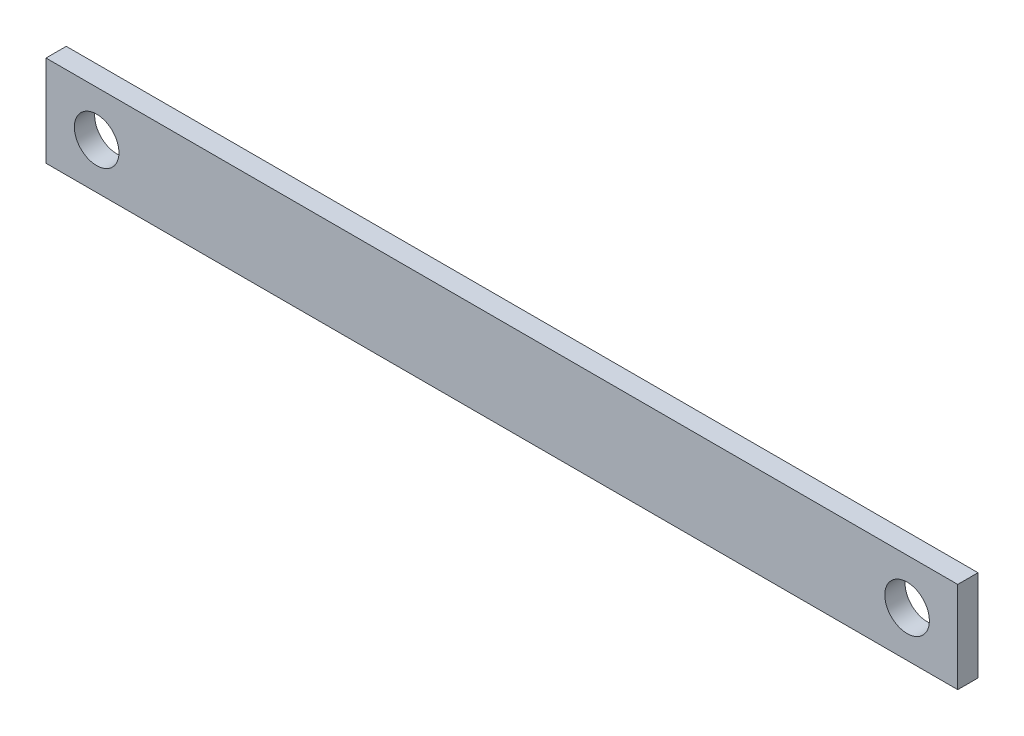
ISO-10303-21;
HEADER;
FILE_DESCRIPTION(('STEP AP214'),'2;1');
FILE_NAME('part.step','',(''),(''),'','','');
FILE_SCHEMA(('AUTOMOTIVE_DESIGN { 1 0 10303 214 1 1 1 1 }'));
ENDSEC;
DATA;
#1=APPLICATION_CONTEXT('core data for automotive mechanical design processes');
#2=APPLICATION_PROTOCOL_DEFINITION('international standard','automotive_design',2000,#1);
#3=PRODUCT_CONTEXT('',#1,'mechanical');
#4=PRODUCT('Part','Part','',(#3));
#5=PRODUCT_RELATED_PRODUCT_CATEGORY('part','',(#4));
#6=PRODUCT_DEFINITION_FORMATION('','',#4);
#7=PRODUCT_DEFINITION_CONTEXT('part definition',#1,'design');
#8=PRODUCT_DEFINITION('design','',#6,#7);
#9=PRODUCT_DEFINITION_SHAPE('','',#8);
#10=(LENGTH_UNIT() NAMED_UNIT(*) SI_UNIT(.MILLI.,.METRE.));
#11=(NAMED_UNIT(*) PLANE_ANGLE_UNIT() SI_UNIT($,.RADIAN.));
#12=(NAMED_UNIT(*) SI_UNIT($,.STERADIAN.) SOLID_ANGLE_UNIT());
#13=UNCERTAINTY_MEASURE_WITH_UNIT(LENGTH_MEASURE(1.E-05),#10,'distance_accuracy_value','');
#14=(GEOMETRIC_REPRESENTATION_CONTEXT(3) GLOBAL_UNCERTAINTY_ASSIGNED_CONTEXT((#13)) GLOBAL_UNIT_ASSIGNED_CONTEXT((#10,
#11,#12)) REPRESENTATION_CONTEXT('',''));
#15=CARTESIAN_POINT('',(0.,0.,0.));
#16=DIRECTION('',(0.,0.,1.));
#17=DIRECTION('',(1.,0.,0.));
#18=AXIS2_PLACEMENT_3D('',#15,#16,#17);
#19=CARTESIAN_POINT('',(0.,5.71499999999998,2.54));
#20=DIRECTION('',(0.,1.,0.));
#21=DIRECTION('',(0.,0.,1.));
#22=AXIS2_PLACEMENT_3D('',#19,#20,#21);
#23=PLANE('',#22);
#24=DIRECTION('',(1.,0.,0.));
#25=VECTOR('',#24,1.);
#26=CARTESIAN_POINT('',(0.,5.71499999999998,0.));
#27=LINE('',#26,#25);
#28=CARTESIAN_POINT('',(-57.15,5.71499999999998,0.));
#29=VERTEX_POINT('',#28);
#30=CARTESIAN_POINT('',(57.15,5.71499999999998,0.));
#31=VERTEX_POINT('',#30);
#32=EDGE_CURVE('E118',#29,#31,#27,.T.);
#33=ORIENTED_EDGE('',*,*,#32,.F.);
#34=DIRECTION('',(0.,0.,-1.));
#35=VECTOR('',#34,1.);
#36=CARTESIAN_POINT('',(-57.15,5.71499999999998,2.54));
#37=LINE('',#36,#35);
#38=CARTESIAN_POINT('',(-57.15,5.71499999999998,2.54));
#39=VERTEX_POINT('',#38);
#40=EDGE_CURVE('E11',#39,#29,#37,.T.);
#41=ORIENTED_EDGE('',*,*,#40,.F.);
#42=DIRECTION('',(1.,0.,0.));
#43=VECTOR('',#42,1.);
#44=CARTESIAN_POINT('',(0.,5.71499999999998,2.54));
#45=LINE('',#44,#43);
#46=CARTESIAN_POINT('',(57.15,5.71499999999998,2.54));
#47=VERTEX_POINT('',#46);
#48=EDGE_CURVE('E99',#39,#47,#45,.T.);
#49=ORIENTED_EDGE('',*,*,#48,.T.);
#50=DIRECTION('',(0.,0.,-1.));
#51=VECTOR('',#50,1.);
#52=CARTESIAN_POINT('',(57.15,5.71499999999998,2.54));
#53=LINE('',#52,#51);
#54=EDGE_CURVE('E58',#47,#31,#53,.T.);
#55=ORIENTED_EDGE('',*,*,#54,.T.);
#56=EDGE_LOOP('',(#33,#41,#49,#55));
#57=FACE_BOUND('',#56,.T.);
#58=ADVANCED_FACE('F41',(#57),#23,.T.);
#59=CARTESIAN_POINT('',(-57.15,0.,2.54));
#60=DIRECTION('',(-1.,0.,0.));
#61=DIRECTION('',(0.,0.,1.));
#62=AXIS2_PLACEMENT_3D('',#59,#60,#61);
#63=PLANE('',#62);
#64=DIRECTION('',(0.,1.,0.));
#65=VECTOR('',#64,1.);
#66=CARTESIAN_POINT('',(-57.15,0.,0.));
#67=LINE('',#66,#65);
#68=CARTESIAN_POINT('',(-57.15,-5.71499999999998,0.));
#69=VERTEX_POINT('',#68);
#70=EDGE_CURVE('E88',#69,#29,#67,.T.);
#71=ORIENTED_EDGE('',*,*,#70,.F.);
#72=DIRECTION('',(0.,0.,-1.));
#73=VECTOR('',#72,1.);
#74=CARTESIAN_POINT('',(-57.15,-5.71499999999998,2.54));
#75=LINE('',#74,#73);
#76=CARTESIAN_POINT('',(-57.15,-5.71499999999998,2.54));
#77=VERTEX_POINT('',#76);
#78=EDGE_CURVE('E50',#77,#69,#75,.T.);
#79=ORIENTED_EDGE('',*,*,#78,.F.);
#80=DIRECTION('',(0.,1.,0.));
#81=VECTOR('',#80,1.);
#82=CARTESIAN_POINT('',(-57.15,0.,2.54));
#83=LINE('',#82,#81);
#84=EDGE_CURVE('E86',#77,#39,#83,.T.);
#85=ORIENTED_EDGE('',*,*,#84,.T.);
#86=ORIENTED_EDGE('',*,*,#40,.T.);
#87=EDGE_LOOP('',(#71,#79,#85,#86));
#88=FACE_BOUND('',#87,.T.);
#89=ADVANCED_FACE('F85',(#88),#63,.T.);
#90=CARTESIAN_POINT('',(0.,-5.71499999999998,2.54));
#91=DIRECTION('',(0.,-1.,0.));
#92=DIRECTION('',(0.,0.,-1.));
#93=AXIS2_PLACEMENT_3D('',#90,#91,#92);
#94=PLANE('',#93);
#95=DIRECTION('',(-1.,0.,0.));
#96=VECTOR('',#95,1.);
#97=CARTESIAN_POINT('',(0.,-5.71499999999998,0.));
#98=LINE('',#97,#96);
#99=CARTESIAN_POINT('',(57.15,-5.71499999999998,0.));
#100=VERTEX_POINT('',#99);
#101=EDGE_CURVE('E123',#100,#69,#98,.T.);
#102=ORIENTED_EDGE('',*,*,#101,.F.);
#103=DIRECTION('',(0.,0.,-1.));
#104=VECTOR('',#103,1.);
#105=CARTESIAN_POINT('',(57.15,-5.71499999999998,2.54));
#106=LINE('',#105,#104);
#107=CARTESIAN_POINT('',(57.15,-5.71499999999998,2.54));
#108=VERTEX_POINT('',#107);
#109=EDGE_CURVE('E71',#108,#100,#106,.T.);
#110=ORIENTED_EDGE('',*,*,#109,.F.);
#111=DIRECTION('',(-1.,0.,0.));
#112=VECTOR('',#111,1.);
#113=CARTESIAN_POINT('',(0.,-5.71499999999998,2.54));
#114=LINE('',#113,#112);
#115=EDGE_CURVE('E98',#108,#77,#114,.T.);
#116=ORIENTED_EDGE('',*,*,#115,.T.);
#117=ORIENTED_EDGE('',*,*,#78,.T.);
#118=EDGE_LOOP('',(#102,#110,#116,#117));
#119=FACE_BOUND('',#118,.T.);
#120=ADVANCED_FACE('F102',(#119),#94,.T.);
#121=CARTESIAN_POINT('',(-50.8,0.,2.54));
#122=DIRECTION('',(0.,0.,-1.));
#123=DIRECTION('',(-1.,0.,0.));
#124=AXIS2_PLACEMENT_3D('',#121,#122,#123);
#125=CYLINDRICAL_SURFACE('',#124,2.794);
#126=CARTESIAN_POINT('',(-50.8,0.,2.54));
#127=DIRECTION('',(0.,0.,1.));
#128=DIRECTION('',(1.,0.,0.));
#129=AXIS2_PLACEMENT_3D('',#126,#127,#128);
#130=CIRCLE('',#129,2.794);
#131=CARTESIAN_POINT('',(-48.006,0.,2.54));
#132=VERTEX_POINT('',#131);
#133=EDGE_CURVE('E107',#132,#132,#130,.T.);
#134=ORIENTED_EDGE('',*,*,#133,.T.);
#135=EDGE_LOOP('',(#134));
#136=FACE_BOUND('',#135,.T.);
#137=CARTESIAN_POINT('',(-50.8,0.,0.));
#138=DIRECTION('',(0.,0.,1.));
#139=DIRECTION('',(1.,0.,0.));
#140=AXIS2_PLACEMENT_3D('',#137,#138,#139);
#141=CIRCLE('',#140,2.794);
#142=CARTESIAN_POINT('',(-48.006,0.,0.));
#143=VERTEX_POINT('',#142);
#144=EDGE_CURVE('E130',#143,#143,#141,.T.);
#145=ORIENTED_EDGE('',*,*,#144,.F.);
#146=EDGE_LOOP('',(#145));
#147=FACE_BOUND('',#146,.T.);
#148=ADVANCED_FACE('F147',(#136,#147),#125,.F.);
#149=CARTESIAN_POINT('',(57.15,0.,2.54));
#150=DIRECTION('',(1.,0.,0.));
#151=DIRECTION('',(0.,0.,-1.));
#152=AXIS2_PLACEMENT_3D('',#149,#150,#151);
#153=PLANE('',#152);
#154=DIRECTION('',(0.,-1.,0.));
#155=VECTOR('',#154,1.);
#156=CARTESIAN_POINT('',(57.15,0.,0.));
#157=LINE('',#156,#155);
#158=EDGE_CURVE('E126',#31,#100,#157,.T.);
#159=ORIENTED_EDGE('',*,*,#158,.F.);
#160=ORIENTED_EDGE('',*,*,#54,.F.);
#161=DIRECTION('',(0.,-1.,0.));
#162=VECTOR('',#161,1.);
#163=CARTESIAN_POINT('',(57.15,0.,2.54));
#164=LINE('',#163,#162);
#165=EDGE_CURVE('E104',#47,#108,#164,.T.);
#166=ORIENTED_EDGE('',*,*,#165,.T.);
#167=ORIENTED_EDGE('',*,*,#109,.T.);
#168=EDGE_LOOP('',(#159,#160,#166,#167));
#169=FACE_BOUND('',#168,.T.);
#170=ADVANCED_FACE('F144',(#169),#153,.T.);
#171=CARTESIAN_POINT('',(50.8,0.,2.54));
#172=DIRECTION('',(0.,0.,-1.));
#173=DIRECTION('',(-1.,0.,0.));
#174=AXIS2_PLACEMENT_3D('',#171,#172,#173);
#175=CYLINDRICAL_SURFACE('',#174,2.794);
#176=CARTESIAN_POINT('',(50.8,0.,2.54));
#177=DIRECTION('',(0.,0.,1.));
#178=DIRECTION('',(1.,0.,0.));
#179=AXIS2_PLACEMENT_3D('',#176,#177,#178);
#180=CIRCLE('',#179,2.794);
#181=CARTESIAN_POINT('',(53.594,0.,2.54));
#182=VERTEX_POINT('',#181);
#183=EDGE_CURVE('E114',#182,#182,#180,.T.);
#184=ORIENTED_EDGE('',*,*,#183,.T.);
#185=EDGE_LOOP('',(#184));
#186=FACE_BOUND('',#185,.T.);
#187=CARTESIAN_POINT('',(50.8,0.,0.));
#188=DIRECTION('',(0.,0.,1.));
#189=DIRECTION('',(1.,0.,0.));
#190=AXIS2_PLACEMENT_3D('',#187,#188,#189);
#191=CIRCLE('',#190,2.794);
#192=CARTESIAN_POINT('',(53.594,0.,0.));
#193=VERTEX_POINT('',#192);
#194=EDGE_CURVE('E134',#193,#193,#191,.T.);
#195=ORIENTED_EDGE('',*,*,#194,.F.);
#196=EDGE_LOOP('',(#195));
#197=FACE_BOUND('',#196,.T.);
#198=ADVANCED_FACE('F146',(#186,#197),#175,.F.);
#199=CARTESIAN_POINT('',(0.,0.,2.54));
#200=DIRECTION('',(0.,0.,1.));
#201=DIRECTION('',(1.,0.,0.));
#202=AXIS2_PLACEMENT_3D('',#199,#200,#201);
#203=PLANE('',#202);
#204=ORIENTED_EDGE('',*,*,#48,.F.);
#205=ORIENTED_EDGE('',*,*,#84,.F.);
#206=ORIENTED_EDGE('',*,*,#115,.F.);
#207=ORIENTED_EDGE('',*,*,#165,.F.);
#208=EDGE_LOOP('',(#204,#205,#206,#207));
#209=FACE_BOUND('',#208,.T.);
#210=ORIENTED_EDGE('',*,*,#133,.F.);
#211=EDGE_LOOP('',(#210));
#212=FACE_BOUND('',#211,.T.);
#213=ORIENTED_EDGE('',*,*,#183,.F.);
#214=EDGE_LOOP('',(#213));
#215=FACE_BOUND('',#214,.T.);
#216=ADVANCED_FACE('F95',(#209,#212,#215),#203,.T.);
#217=CARTESIAN_POINT('',(0.,0.,0.));
#218=DIRECTION('',(0.,0.,1.));
#219=DIRECTION('',(1.,0.,0.));
#220=AXIS2_PLACEMENT_3D('',#217,#218,#219);
#221=PLANE('',#220);
#222=ORIENTED_EDGE('',*,*,#32,.T.);
#223=ORIENTED_EDGE('',*,*,#158,.T.);
#224=ORIENTED_EDGE('',*,*,#101,.T.);
#225=ORIENTED_EDGE('',*,*,#70,.T.);
#226=EDGE_LOOP('',(#222,#223,#224,#225));
#227=FACE_BOUND('',#226,.T.);
#228=ORIENTED_EDGE('',*,*,#144,.T.);
#229=EDGE_LOOP('',(#228));
#230=FACE_BOUND('',#229,.T.);
#231=ORIENTED_EDGE('',*,*,#194,.T.);
#232=EDGE_LOOP('',(#231));
#233=FACE_BOUND('',#232,.T.);
#234=ADVANCED_FACE('F192',(#227,#230,#233),#221,.F.);
#235=CLOSED_SHELL('',(#58,#89,#120,#148,#170,#198,#216,#234));
#236=MANIFOLD_SOLID_BREP('B2',#235);
#237=ADVANCED_BREP_SHAPE_REPRESENTATION('',(#18,#236),#14);
#238=SHAPE_DEFINITION_REPRESENTATION(#9,#237);
ENDSEC;
END-ISO-10303-21;
